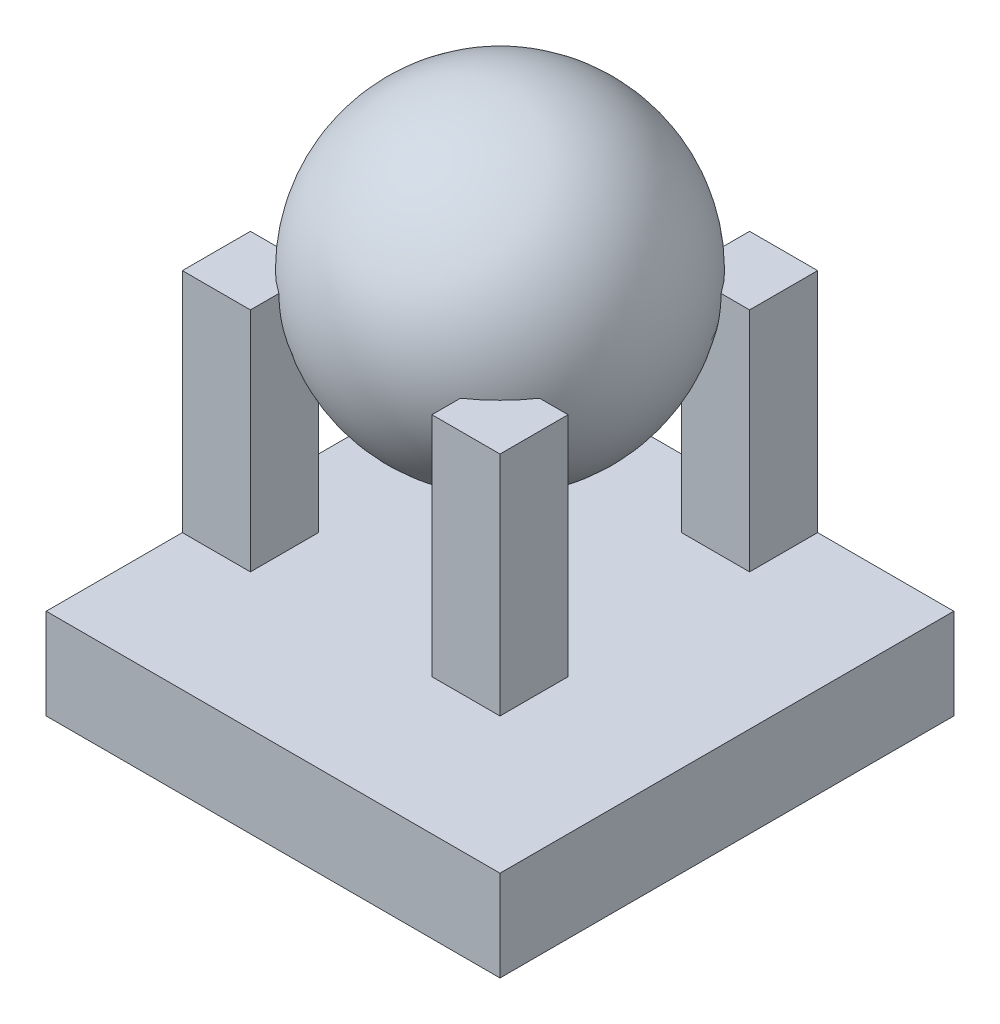
ISO-10303-21;
HEADER;
FILE_DESCRIPTION(('STEP AP214'),'2;1');
FILE_NAME('part.step','',(''),(''),'','','');
FILE_SCHEMA(('AUTOMOTIVE_DESIGN { 1 0 10303 214 1 1 1 1 }'));
ENDSEC;
DATA;
#1=APPLICATION_CONTEXT('core data for automotive mechanical design processes');
#2=APPLICATION_PROTOCOL_DEFINITION('international standard','automotive_design',2000,#1);
#3=PRODUCT_CONTEXT('',#1,'mechanical');
#4=PRODUCT('Part','Part','',(#3));
#5=PRODUCT_RELATED_PRODUCT_CATEGORY('part','',(#4));
#6=PRODUCT_DEFINITION_FORMATION('','',#4);
#7=PRODUCT_DEFINITION_CONTEXT('part definition',#1,'design');
#8=PRODUCT_DEFINITION('design','',#6,#7);
#9=PRODUCT_DEFINITION_SHAPE('','',#8);
#10=(LENGTH_UNIT() NAMED_UNIT(*) SI_UNIT(.MILLI.,.METRE.));
#11=(NAMED_UNIT(*) PLANE_ANGLE_UNIT() SI_UNIT($,.RADIAN.));
#12=(NAMED_UNIT(*) SI_UNIT($,.STERADIAN.) SOLID_ANGLE_UNIT());
#13=UNCERTAINTY_MEASURE_WITH_UNIT(LENGTH_MEASURE(1.E-05),#10,'distance_accuracy_value','');
#14=(GEOMETRIC_REPRESENTATION_CONTEXT(3) GLOBAL_UNCERTAINTY_ASSIGNED_CONTEXT((#13)) GLOBAL_UNIT_ASSIGNED_CONTEXT((#10,
#11,#12)) REPRESENTATION_CONTEXT('',''));
#15=CARTESIAN_POINT('',(0.,0.,0.));
#16=DIRECTION('',(0.,0.,1.));
#17=DIRECTION('',(1.,0.,0.));
#18=AXIS2_PLACEMENT_3D('',#15,#16,#17);
#19=CARTESIAN_POINT('',(0.,20.,0.));
#20=DIRECTION('',(0.,-1.,0.));
#21=DIRECTION('',(0.,0.,-1.));
#22=AXIS2_PLACEMENT_3D('',#19,#20,#21);
#23=PLANE('',#22);
#24=DIRECTION('',(0.,0.,-1.));
#25=VECTOR('',#24,1.);
#26=CARTESIAN_POINT('',(-35.,20.,-35.));
#27=LINE('',#26,#25);
#28=CARTESIAN_POINT('',(-35.,20.,-35.));
#29=VERTEX_POINT('',#28);
#30=CARTESIAN_POINT('',(-35.,20.,-50.));
#31=VERTEX_POINT('',#30);
#32=EDGE_CURVE('E258',#29,#31,#27,.T.);
#33=ORIENTED_EDGE('',*,*,#32,.F.);
#34=DIRECTION('',(1.,0.,0.));
#35=VECTOR('',#34,1.);
#36=CARTESIAN_POINT('',(-50.,20.,-35.));
#37=LINE('',#36,#35);
#38=CARTESIAN_POINT('',(-50.,20.,-35.));
#39=VERTEX_POINT('',#38);
#40=EDGE_CURVE('E263',#39,#29,#37,.T.);
#41=ORIENTED_EDGE('',*,*,#40,.F.);
#42=DIRECTION('',(0.,0.,1.));
#43=VECTOR('',#42,1.);
#44=CARTESIAN_POINT('',(-50.,20.,50.));
#45=LINE('',#44,#43);
#46=CARTESIAN_POINT('',(-50.,20.,5.));
#47=VERTEX_POINT('',#46);
#48=EDGE_CURVE('E383',#39,#47,#45,.T.);
#49=ORIENTED_EDGE('',*,*,#48,.T.);
#50=DIRECTION('',(-1.,0.,0.));
#51=VECTOR('',#50,1.);
#52=CARTESIAN_POINT('',(-50.,20.,5.));
#53=LINE('',#52,#51);
#54=CARTESIAN_POINT('',(-35.,20.,5.));
#55=VERTEX_POINT('',#54);
#56=EDGE_CURVE('E351',#55,#47,#53,.T.);
#57=ORIENTED_EDGE('',*,*,#56,.F.);
#58=DIRECTION('',(0.,0.,-1.));
#59=VECTOR('',#58,1.);
#60=CARTESIAN_POINT('',(-35.,20.,20.));
#61=LINE('',#60,#59);
#62=CARTESIAN_POINT('',(-35.,20.,20.));
#63=VERTEX_POINT('',#62);
#64=EDGE_CURVE('E332',#63,#55,#61,.T.);
#65=ORIENTED_EDGE('',*,*,#64,.F.);
#66=DIRECTION('',(1.,0.,0.));
#67=VECTOR('',#66,1.);
#68=CARTESIAN_POINT('',(-50.,20.,20.));
#69=LINE('',#68,#67);
#70=CARTESIAN_POINT('',(-50.,20.,20.));
#71=VERTEX_POINT('',#70);
#72=EDGE_CURVE('E338',#71,#63,#69,.T.);
#73=ORIENTED_EDGE('',*,*,#72,.F.);
#74=CARTESIAN_POINT('',(-50.,20.,50.));
#75=VERTEX_POINT('',#74);
#76=EDGE_CURVE('E382',#71,#75,#45,.T.);
#77=ORIENTED_EDGE('',*,*,#76,.T.);
#78=DIRECTION('',(1.,0.,0.));
#79=VECTOR('',#78,1.);
#80=CARTESIAN_POINT('',(-50.,20.,50.));
#81=LINE('',#80,#79);
#82=CARTESIAN_POINT('',(50.,20.,50.));
#83=VERTEX_POINT('',#82);
#84=EDGE_CURVE('E386',#75,#83,#81,.T.);
#85=ORIENTED_EDGE('',*,*,#84,.T.);
#86=DIRECTION('',(0.,0.,-1.));
#87=VECTOR('',#86,1.);
#88=CARTESIAN_POINT('',(50.,20.,50.));
#89=LINE('',#88,#87);
#90=CARTESIAN_POINT('',(50.,20.,-50.));
#91=VERTEX_POINT('',#90);
#92=EDGE_CURVE('E373',#83,#91,#89,.T.);
#93=ORIENTED_EDGE('',*,*,#92,.T.);
#94=DIRECTION('',(-1.,0.,0.));
#95=VECTOR('',#94,1.);
#96=CARTESIAN_POINT('',(-50.,20.,-50.));
#97=LINE('',#96,#95);
#98=CARTESIAN_POINT('',(20.,20.,-50.));
#99=VERTEX_POINT('',#98);
#100=EDGE_CURVE('E379',#91,#99,#97,.T.);
#101=ORIENTED_EDGE('',*,*,#100,.T.);
#102=DIRECTION('',(0.,0.,-1.));
#103=VECTOR('',#102,1.);
#104=CARTESIAN_POINT('',(20.,20.,-35.));
#105=LINE('',#104,#103);
#106=CARTESIAN_POINT('',(20.,20.,-35.));
#107=VERTEX_POINT('',#106);
#108=EDGE_CURVE('E291',#107,#99,#105,.T.);
#109=ORIENTED_EDGE('',*,*,#108,.F.);
#110=DIRECTION('',(1.,0.,0.));
#111=VECTOR('',#110,1.);
#112=CARTESIAN_POINT('',(5.,20.,-35.));
#113=LINE('',#112,#111);
#114=CARTESIAN_POINT('',(5.,20.,-35.));
#115=VERTEX_POINT('',#114);
#116=EDGE_CURVE('E297',#115,#107,#113,.T.);
#117=ORIENTED_EDGE('',*,*,#116,.F.);
#118=DIRECTION('',(0.,0.,1.));
#119=VECTOR('',#118,1.);
#120=CARTESIAN_POINT('',(5.,20.,-35.));
#121=LINE('',#120,#119);
#122=CARTESIAN_POINT('',(5.,20.,-50.));
#123=VERTEX_POINT('',#122);
#124=EDGE_CURVE('E311',#123,#115,#121,.T.);
#125=ORIENTED_EDGE('',*,*,#124,.F.);
#126=EDGE_CURVE('E377',#123,#31,#97,.T.);
#127=ORIENTED_EDGE('',*,*,#126,.T.);
#128=EDGE_LOOP('',(#33,#41,#49,#57,#65,#73,#77,#85,#93,#101,#109,#117,#125,#127));
#129=FACE_BOUND('',#128,.T.);
#130=DIRECTION('',(0.,0.,-1.));
#131=VECTOR('',#130,1.);
#132=CARTESIAN_POINT('',(20.,20.,20.));
#133=LINE('',#132,#131);
#134=CARTESIAN_POINT('',(20.,20.,20.));
#135=VERTEX_POINT('',#134);
#136=CARTESIAN_POINT('',(20.,20.,5.));
#137=VERTEX_POINT('',#136);
#138=EDGE_CURVE('E231',#135,#137,#133,.T.);
#139=ORIENTED_EDGE('',*,*,#138,.F.);
#140=DIRECTION('',(1.,0.,0.));
#141=VECTOR('',#140,1.);
#142=CARTESIAN_POINT('',(5.,20.,20.));
#143=LINE('',#142,#141);
#144=CARTESIAN_POINT('',(5.,20.,20.));
#145=VERTEX_POINT('',#144);
#146=EDGE_CURVE('E224',#145,#135,#143,.T.);
#147=ORIENTED_EDGE('',*,*,#146,.F.);
#148=DIRECTION('',(0.,0.,1.));
#149=VECTOR('',#148,1.);
#150=CARTESIAN_POINT('',(5.,20.,20.));
#151=LINE('',#150,#149);
#152=CARTESIAN_POINT('',(5.,20.,5.));
#153=VERTEX_POINT('',#152);
#154=EDGE_CURVE('E239',#153,#145,#151,.T.);
#155=ORIENTED_EDGE('',*,*,#154,.F.);
#156=DIRECTION('',(-1.,0.,0.));
#157=VECTOR('',#156,1.);
#158=CARTESIAN_POINT('',(5.,20.,5.));
#159=LINE('',#158,#157);
#160=EDGE_CURVE('E235',#137,#153,#159,.T.);
#161=ORIENTED_EDGE('',*,*,#160,.F.);
#162=EDGE_LOOP('',(#139,#147,#155,#161));
#163=FACE_BOUND('',#162,.T.);
#164=ADVANCED_FACE('F39',(#129,#163),#23,.F.);
#165=CARTESIAN_POINT('',(50.,20.,50.));
#166=DIRECTION('',(-1.,0.,0.));
#167=DIRECTION('',(0.,0.,1.));
#168=AXIS2_PLACEMENT_3D('',#165,#166,#167);
#169=PLANE('',#168);
#170=DIRECTION('',(0.,0.,-1.));
#171=VECTOR('',#170,1.);
#172=CARTESIAN_POINT('',(50.,0.,50.));
#173=LINE('',#172,#171);
#174=CARTESIAN_POINT('',(50.,0.,50.));
#175=VERTEX_POINT('',#174);
#176=CARTESIAN_POINT('',(50.,0.,-50.));
#177=VERTEX_POINT('',#176);
#178=EDGE_CURVE('E372',#175,#177,#173,.T.);
#179=ORIENTED_EDGE('',*,*,#178,.T.);
#180=DIRECTION('',(0.,-1.,0.));
#181=VECTOR('',#180,1.);
#182=CARTESIAN_POINT('',(50.,20.,-50.));
#183=LINE('',#182,#181);
#184=EDGE_CURVE('E48',#91,#177,#183,.T.);
#185=ORIENTED_EDGE('',*,*,#184,.F.);
#186=ORIENTED_EDGE('',*,*,#92,.F.);
#187=DIRECTION('',(0.,-1.,0.));
#188=VECTOR('',#187,1.);
#189=CARTESIAN_POINT('',(50.,20.,50.));
#190=LINE('',#189,#188);
#191=EDGE_CURVE('E389',#83,#175,#190,.T.);
#192=ORIENTED_EDGE('',*,*,#191,.T.);
#193=EDGE_LOOP('',(#179,#185,#186,#192));
#194=FACE_BOUND('',#193,.T.);
#195=ADVANCED_FACE('F41',(#194),#169,.F.);
#196=CARTESIAN_POINT('',(-50.,20.,-50.));
#197=DIRECTION('',(0.,0.,1.));
#198=DIRECTION('',(1.,0.,0.));
#199=AXIS2_PLACEMENT_3D('',#196,#197,#198);
#200=PLANE('',#199);
#201=DIRECTION('',(-1.,0.,0.));
#202=VECTOR('',#201,1.);
#203=CARTESIAN_POINT('',(-50.,0.,-50.));
#204=LINE('',#203,#202);
#205=CARTESIAN_POINT('',(-50.,0.,-50.));
#206=VERTEX_POINT('',#205);
#207=EDGE_CURVE('E393',#177,#206,#204,.T.);
#208=ORIENTED_EDGE('',*,*,#207,.T.);
#209=DIRECTION('',(0.,-1.,0.));
#210=VECTOR('',#209,1.);
#211=CARTESIAN_POINT('',(-50.,20.,-50.));
#212=LINE('',#211,#210);
#213=CARTESIAN_POINT('',(-50.,70.,-50.));
#214=VERTEX_POINT('',#213);
#215=EDGE_CURVE('E408',#214,#206,#212,.T.);
#216=ORIENTED_EDGE('',*,*,#215,.F.);
#217=DIRECTION('',(-1.,0.,0.));
#218=VECTOR('',#217,1.);
#219=CARTESIAN_POINT('',(-50.,70.,-50.));
#220=LINE('',#219,#218);
#221=CARTESIAN_POINT('',(-35.,70.,-50.));
#222=VERTEX_POINT('',#221);
#223=EDGE_CURVE('E262',#222,#214,#220,.T.);
#224=ORIENTED_EDGE('',*,*,#223,.F.);
#225=DIRECTION('',(0.,-1.,0.));
#226=VECTOR('',#225,1.);
#227=CARTESIAN_POINT('',(-35.,70.,-50.));
#228=LINE('',#227,#226);
#229=EDGE_CURVE('E287',#222,#31,#228,.T.);
#230=ORIENTED_EDGE('',*,*,#229,.T.);
#231=ORIENTED_EDGE('',*,*,#126,.F.);
#232=DIRECTION('',(0.,-1.,0.));
#233=VECTOR('',#232,1.);
#234=CARTESIAN_POINT('',(5.,70.,-50.));
#235=LINE('',#234,#233);
#236=CARTESIAN_POINT('',(5.,70.,-50.));
#237=VERTEX_POINT('',#236);
#238=EDGE_CURVE('E324',#237,#123,#235,.T.);
#239=ORIENTED_EDGE('',*,*,#238,.F.);
#240=DIRECTION('',(-1.,0.,0.));
#241=VECTOR('',#240,1.);
#242=CARTESIAN_POINT('',(5.,70.,-50.));
#243=LINE('',#242,#241);
#244=CARTESIAN_POINT('',(20.,70.,-50.));
#245=VERTEX_POINT('',#244);
#246=EDGE_CURVE('E296',#245,#237,#243,.T.);
#247=ORIENTED_EDGE('',*,*,#246,.F.);
#248=DIRECTION('',(0.,-1.,0.));
#249=VECTOR('',#248,1.);
#250=CARTESIAN_POINT('',(20.,70.,-50.));
#251=LINE('',#250,#249);
#252=EDGE_CURVE('E328',#245,#99,#251,.T.);
#253=ORIENTED_EDGE('',*,*,#252,.T.);
#254=ORIENTED_EDGE('',*,*,#100,.F.);
#255=ORIENTED_EDGE('',*,*,#184,.T.);
#256=EDGE_LOOP('',(#208,#216,#224,#230,#231,#239,#247,#253,#254,#255));
#257=FACE_BOUND('',#256,.T.);
#258=ADVANCED_FACE('F415',(#257),#200,.F.);
#259=CARTESIAN_POINT('',(-50.,20.,50.));
#260=DIRECTION('',(1.,0.,0.));
#261=DIRECTION('',(0.,0.,-1.));
#262=AXIS2_PLACEMENT_3D('',#259,#260,#261);
#263=PLANE('',#262);
#264=DIRECTION('',(0.,0.,1.));
#265=VECTOR('',#264,1.);
#266=CARTESIAN_POINT('',(-50.,0.,50.));
#267=LINE('',#266,#265);
#268=CARTESIAN_POINT('',(-50.,0.,50.));
#269=VERTEX_POINT('',#268);
#270=EDGE_CURVE('E396',#206,#269,#267,.T.);
#271=ORIENTED_EDGE('',*,*,#270,.T.);
#272=DIRECTION('',(0.,-1.,0.));
#273=VECTOR('',#272,1.);
#274=CARTESIAN_POINT('',(-50.,20.,50.));
#275=LINE('',#274,#273);
#276=EDGE_CURVE('E404',#75,#269,#275,.T.);
#277=ORIENTED_EDGE('',*,*,#276,.F.);
#278=ORIENTED_EDGE('',*,*,#76,.F.);
#279=DIRECTION('',(0.,-1.,0.));
#280=VECTOR('',#279,1.);
#281=CARTESIAN_POINT('',(-50.,70.,20.));
#282=LINE('',#281,#280);
#283=CARTESIAN_POINT('',(-50.,70.,20.));
#284=VERTEX_POINT('',#283);
#285=EDGE_CURVE('E361',#284,#71,#282,.T.);
#286=ORIENTED_EDGE('',*,*,#285,.F.);
#287=DIRECTION('',(0.,0.,1.));
#288=VECTOR('',#287,1.);
#289=CARTESIAN_POINT('',(-50.,70.,20.));
#290=LINE('',#289,#288);
#291=CARTESIAN_POINT('',(-50.,70.,5.));
#292=VERTEX_POINT('',#291);
#293=EDGE_CURVE('E341',#292,#284,#290,.T.);
#294=ORIENTED_EDGE('',*,*,#293,.F.);
#295=DIRECTION('',(0.,-1.,0.));
#296=VECTOR('',#295,1.);
#297=CARTESIAN_POINT('',(-50.,70.,5.));
#298=LINE('',#297,#296);
#299=EDGE_CURVE('E365',#292,#47,#298,.T.);
#300=ORIENTED_EDGE('',*,*,#299,.T.);
#301=ORIENTED_EDGE('',*,*,#48,.F.);
#302=DIRECTION('',(0.,-1.,0.));
#303=VECTOR('',#302,1.);
#304=CARTESIAN_POINT('',(-50.,70.,-35.));
#305=LINE('',#304,#303);
#306=CARTESIAN_POINT('',(-50.,70.,-35.));
#307=VERTEX_POINT('',#306);
#308=EDGE_CURVE('E283',#307,#39,#305,.T.);
#309=ORIENTED_EDGE('',*,*,#308,.F.);
#310=DIRECTION('',(0.,0.,1.));
#311=VECTOR('',#310,1.);
#312=CARTESIAN_POINT('',(-50.,70.,-35.));
#313=LINE('',#312,#311);
#314=EDGE_CURVE('E267',#214,#307,#313,.T.);
#315=ORIENTED_EDGE('',*,*,#314,.F.);
#316=ORIENTED_EDGE('',*,*,#215,.T.);
#317=EDGE_LOOP('',(#271,#277,#278,#286,#294,#300,#301,#309,#315,#316));
#318=FACE_BOUND('',#317,.T.);
#319=ADVANCED_FACE('F426',(#318),#263,.F.);
#320=CARTESIAN_POINT('',(-50.,20.,50.));
#321=DIRECTION('',(0.,0.,-1.));
#322=DIRECTION('',(-1.,0.,0.));
#323=AXIS2_PLACEMENT_3D('',#320,#321,#322);
#324=PLANE('',#323);
#325=DIRECTION('',(1.,0.,0.));
#326=VECTOR('',#325,1.);
#327=CARTESIAN_POINT('',(-50.,0.,50.));
#328=LINE('',#327,#326);
#329=EDGE_CURVE('E378',#269,#175,#328,.T.);
#330=ORIENTED_EDGE('',*,*,#329,.T.);
#331=ORIENTED_EDGE('',*,*,#191,.F.);
#332=ORIENTED_EDGE('',*,*,#84,.F.);
#333=ORIENTED_EDGE('',*,*,#276,.T.);
#334=EDGE_LOOP('',(#330,#331,#332,#333));
#335=FACE_BOUND('',#334,.T.);
#336=ADVANCED_FACE('F431',(#335),#324,.F.);
#337=CARTESIAN_POINT('',(0.,0.,0.));
#338=DIRECTION('',(0.,-1.,0.));
#339=DIRECTION('',(0.,0.,-1.));
#340=AXIS2_PLACEMENT_3D('',#337,#338,#339);
#341=PLANE('',#340);
#342=ORIENTED_EDGE('',*,*,#178,.F.);
#343=ORIENTED_EDGE('',*,*,#329,.F.);
#344=ORIENTED_EDGE('',*,*,#270,.F.);
#345=ORIENTED_EDGE('',*,*,#207,.F.);
#346=EDGE_LOOP('',(#342,#343,#344,#345));
#347=FACE_BOUND('',#346,.T.);
#348=ADVANCED_FACE('F422',(#347),#341,.T.);
#349=CARTESIAN_POINT('',(-35.,70.,20.));
#350=DIRECTION('',(-1.,0.,0.));
#351=DIRECTION('',(0.,0.,1.));
#352=AXIS2_PLACEMENT_3D('',#349,#350,#351);
#353=PLANE('',#352);
#354=DIRECTION('',(0.,-1.,0.));
#355=VECTOR('',#354,1.);
#356=CARTESIAN_POINT('',(-35.,70.,5.));
#357=LINE('',#356,#355);
#358=CARTESIAN_POINT('',(-35.,49.3844718719117,5.));
#359=VERTEX_POINT('',#358);
#360=EDGE_CURVE('E369',#359,#55,#357,.T.);
#361=ORIENTED_EDGE('',*,*,#360,.F.);
#362=CARTESIAN_POINT('',(-35.,70.,-15.));
#363=DIRECTION('',(-1.,0.,0.));
#364=DIRECTION('',(0.,0.,1.));
#365=AXIS2_PLACEMENT_3D('',#362,#363,#364);
#366=CIRCLE('',#365,28.7228132326901);
#367=CARTESIAN_POINT('',(-35.,70.,13.7228132326901));
#368=VERTEX_POINT('',#367);
#369=EDGE_CURVE('E236',#359,#368,#366,.T.);
#370=ORIENTED_EDGE('',*,*,#369,.T.);
#371=DIRECTION('',(0.,0.,-1.));
#372=VECTOR('',#371,1.);
#373=CARTESIAN_POINT('',(-35.,70.,20.));
#374=LINE('',#373,#372);
#375=CARTESIAN_POINT('',(-35.,70.,20.));
#376=VERTEX_POINT('',#375);
#377=EDGE_CURVE('E333',#376,#368,#374,.T.);
#378=ORIENTED_EDGE('',*,*,#377,.F.);
#379=DIRECTION('',(0.,-1.,0.));
#380=VECTOR('',#379,1.);
#381=CARTESIAN_POINT('',(-35.,70.,20.));
#382=LINE('',#381,#380);
#383=EDGE_CURVE('E347',#376,#63,#382,.T.);
#384=ORIENTED_EDGE('',*,*,#383,.T.);
#385=ORIENTED_EDGE('',*,*,#64,.T.);
#386=EDGE_LOOP('',(#361,#370,#378,#384,#385));
#387=FACE_BOUND('',#386,.T.);
#388=ADVANCED_FACE('F472',(#387),#353,.F.);
#389=CARTESIAN_POINT('',(-50.,70.,5.));
#390=DIRECTION('',(0.,0.,1.));
#391=DIRECTION('',(1.,0.,0.));
#392=AXIS2_PLACEMENT_3D('',#389,#390,#391);
#393=PLANE('',#392);
#394=DIRECTION('',(-1.,0.,0.));
#395=VECTOR('',#394,1.);
#396=CARTESIAN_POINT('',(-50.,70.,5.));
#397=LINE('',#396,#395);
#398=CARTESIAN_POINT('',(-43.7228132326901,70.,5.));
#399=VERTEX_POINT('',#398);
#400=EDGE_CURVE('E337',#399,#292,#397,.T.);
#401=ORIENTED_EDGE('',*,*,#400,.F.);
#402=CARTESIAN_POINT('',(-15.,70.,5.));
#403=DIRECTION('',(0.,0.,1.));
#404=DIRECTION('',(1.,0.,0.));
#405=AXIS2_PLACEMENT_3D('',#402,#403,#404);
#406=CIRCLE('',#405,28.7228132326901);
#407=EDGE_CURVE('E55',#399,#359,#406,.T.);
#408=ORIENTED_EDGE('',*,*,#407,.T.);
#409=ORIENTED_EDGE('',*,*,#360,.T.);
#410=ORIENTED_EDGE('',*,*,#56,.T.);
#411=ORIENTED_EDGE('',*,*,#299,.F.);
#412=EDGE_LOOP('',(#401,#408,#409,#410,#411));
#413=FACE_BOUND('',#412,.T.);
#414=ADVANCED_FACE('F460',(#413),#393,.F.);
#415=CARTESIAN_POINT('',(-50.,70.,20.));
#416=DIRECTION('',(0.,0.,-1.));
#417=DIRECTION('',(-1.,0.,0.));
#418=AXIS2_PLACEMENT_3D('',#415,#416,#417);
#419=PLANE('',#418);
#420=ORIENTED_EDGE('',*,*,#72,.T.);
#421=ORIENTED_EDGE('',*,*,#383,.F.);
#422=DIRECTION('',(1.,0.,0.));
#423=VECTOR('',#422,1.);
#424=CARTESIAN_POINT('',(-50.,70.,20.));
#425=LINE('',#424,#423);
#426=EDGE_CURVE('E344',#284,#376,#425,.T.);
#427=ORIENTED_EDGE('',*,*,#426,.F.);
#428=ORIENTED_EDGE('',*,*,#285,.T.);
#429=EDGE_LOOP('',(#420,#421,#427,#428));
#430=FACE_BOUND('',#429,.T.);
#431=ADVANCED_FACE('F475',(#430),#419,.F.);
#432=CARTESIAN_POINT('',(0.,70.,0.));
#433=DIRECTION('',(0.,-1.,0.));
#434=DIRECTION('',(0.,0.,-1.));
#435=AXIS2_PLACEMENT_3D('',#432,#433,#434);
#436=PLANE('',#435);
#437=ORIENTED_EDGE('',*,*,#377,.T.);
#438=CARTESIAN_POINT('',(-15.,70.,-15.));
#439=DIRECTION('',(0.,-1.,0.));
#440=DIRECTION('',(0.,0.,-1.));
#441=AXIS2_PLACEMENT_3D('',#438,#439,#440);
#442=CIRCLE('',#441,35.);
#443=EDGE_CURVE('E467',#368,#399,#442,.T.);
#444=ORIENTED_EDGE('',*,*,#443,.T.);
#445=ORIENTED_EDGE('',*,*,#400,.T.);
#446=ORIENTED_EDGE('',*,*,#293,.T.);
#447=ORIENTED_EDGE('',*,*,#426,.T.);
#448=EDGE_LOOP('',(#437,#444,#445,#446,#447));
#449=FACE_BOUND('',#448,.T.);
#450=ADVANCED_FACE('F465',(#449),#436,.F.);
#451=CARTESIAN_POINT('',(20.,70.,-35.));
#452=DIRECTION('',(-1.,0.,0.));
#453=DIRECTION('',(0.,0.,1.));
#454=AXIS2_PLACEMENT_3D('',#451,#452,#453);
#455=PLANE('',#454);
#456=ORIENTED_EDGE('',*,*,#108,.T.);
#457=ORIENTED_EDGE('',*,*,#252,.F.);
#458=DIRECTION('',(0.,0.,-1.));
#459=VECTOR('',#458,1.);
#460=CARTESIAN_POINT('',(20.,70.,-35.));
#461=LINE('',#460,#459);
#462=CARTESIAN_POINT('',(20.,70.,-35.));
#463=VERTEX_POINT('',#462);
#464=EDGE_CURVE('E292',#463,#245,#461,.T.);
#465=ORIENTED_EDGE('',*,*,#464,.F.);
#466=DIRECTION('',(0.,-1.,0.));
#467=VECTOR('',#466,1.);
#468=CARTESIAN_POINT('',(20.,70.,-35.));
#469=LINE('',#468,#467);
#470=EDGE_CURVE('E307',#463,#107,#469,.T.);
#471=ORIENTED_EDGE('',*,*,#470,.T.);
#472=EDGE_LOOP('',(#456,#457,#465,#471));
#473=FACE_BOUND('',#472,.T.);
#474=ADVANCED_FACE('F482',(#473),#455,.F.);
#475=CARTESIAN_POINT('',(5.,70.,-35.));
#476=DIRECTION('',(1.,0.,0.));
#477=DIRECTION('',(0.,0.,-1.));
#478=AXIS2_PLACEMENT_3D('',#475,#476,#477);
#479=PLANE('',#478);
#480=DIRECTION('',(0.,-1.,0.));
#481=VECTOR('',#480,1.);
#482=CARTESIAN_POINT('',(5.,70.,-35.));
#483=LINE('',#482,#481);
#484=CARTESIAN_POINT('',(5.,49.3844718719117,-35.));
#485=VERTEX_POINT('',#484);
#486=EDGE_CURVE('E321',#485,#115,#483,.T.);
#487=ORIENTED_EDGE('',*,*,#486,.F.);
#488=CARTESIAN_POINT('',(5.,70.,-15.));
#489=DIRECTION('',(1.,0.,0.));
#490=DIRECTION('',(0.,0.,-1.));
#491=AXIS2_PLACEMENT_3D('',#488,#489,#490);
#492=CIRCLE('',#491,28.7228132326901);
#493=CARTESIAN_POINT('',(5.,70.,-43.7228132326901));
#494=VERTEX_POINT('',#493);
#495=EDGE_CURVE('E648',#485,#494,#492,.T.);
#496=ORIENTED_EDGE('',*,*,#495,.T.);
#497=DIRECTION('',(0.,0.,1.));
#498=VECTOR('',#497,1.);
#499=CARTESIAN_POINT('',(5.,70.,-35.));
#500=LINE('',#499,#498);
#501=EDGE_CURVE('E300',#237,#494,#500,.T.);
#502=ORIENTED_EDGE('',*,*,#501,.F.);
#503=ORIENTED_EDGE('',*,*,#238,.T.);
#504=ORIENTED_EDGE('',*,*,#124,.T.);
#505=EDGE_LOOP('',(#487,#496,#502,#503,#504));
#506=FACE_BOUND('',#505,.T.);
#507=ADVANCED_FACE('F538',(#506),#479,.F.);
#508=CARTESIAN_POINT('',(5.,70.,-35.));
#509=DIRECTION('',(0.,0.,-1.));
#510=DIRECTION('',(-1.,0.,0.));
#511=AXIS2_PLACEMENT_3D('',#508,#509,#510);
#512=PLANE('',#511);
#513=DIRECTION('',(1.,0.,0.));
#514=VECTOR('',#513,1.);
#515=CARTESIAN_POINT('',(5.,70.,-35.));
#516=LINE('',#515,#514);
#517=CARTESIAN_POINT('',(13.7228132326901,70.,-35.));
#518=VERTEX_POINT('',#517);
#519=EDGE_CURVE('E304',#518,#463,#516,.T.);
#520=ORIENTED_EDGE('',*,*,#519,.F.);
#521=CARTESIAN_POINT('',(-15.,70.,-35.));
#522=DIRECTION('',(0.,0.,-1.));
#523=DIRECTION('',(-1.,0.,0.));
#524=AXIS2_PLACEMENT_3D('',#521,#522,#523);
#525=CIRCLE('',#524,28.7228132326901);
#526=EDGE_CURVE('E63',#518,#485,#525,.T.);
#527=ORIENTED_EDGE('',*,*,#526,.T.);
#528=ORIENTED_EDGE('',*,*,#486,.T.);
#529=ORIENTED_EDGE('',*,*,#116,.T.);
#530=ORIENTED_EDGE('',*,*,#470,.F.);
#531=EDGE_LOOP('',(#520,#527,#528,#529,#530));
#532=FACE_BOUND('',#531,.T.);
#533=ADVANCED_FACE('F543',(#532),#512,.F.);
#534=CARTESIAN_POINT('',(0.,70.,0.));
#535=DIRECTION('',(0.,-1.,0.));
#536=DIRECTION('',(0.,0.,-1.));
#537=AXIS2_PLACEMENT_3D('',#534,#535,#536);
#538=PLANE('',#537);
#539=ORIENTED_EDGE('',*,*,#501,.T.);
#540=CARTESIAN_POINT('',(-15.,70.,-15.));
#541=DIRECTION('',(0.,-1.,0.));
#542=DIRECTION('',(0.,0.,-1.));
#543=AXIS2_PLACEMENT_3D('',#540,#541,#542);
#544=CIRCLE('',#543,35.);
#545=EDGE_CURVE('E649',#494,#518,#544,.T.);
#546=ORIENTED_EDGE('',*,*,#545,.T.);
#547=ORIENTED_EDGE('',*,*,#519,.T.);
#548=ORIENTED_EDGE('',*,*,#464,.T.);
#549=ORIENTED_EDGE('',*,*,#246,.T.);
#550=EDGE_LOOP('',(#539,#546,#547,#548,#549));
#551=FACE_BOUND('',#550,.T.);
#552=ADVANCED_FACE('F553',(#551),#538,.F.);
#553=CARTESIAN_POINT('',(-35.,70.,-35.));
#554=DIRECTION('',(-1.,0.,0.));
#555=DIRECTION('',(0.,0.,1.));
#556=AXIS2_PLACEMENT_3D('',#553,#554,#555);
#557=PLANE('',#556);
#558=DIRECTION('',(0.,0.,-1.));
#559=VECTOR('',#558,1.);
#560=CARTESIAN_POINT('',(-35.,70.,-35.));
#561=LINE('',#560,#559);
#562=CARTESIAN_POINT('',(-35.,70.,-43.7228132326901));
#563=VERTEX_POINT('',#562);
#564=EDGE_CURVE('E259',#563,#222,#561,.T.);
#565=ORIENTED_EDGE('',*,*,#564,.F.);
#566=CARTESIAN_POINT('',(-35.,70.,-15.));
#567=DIRECTION('',(-1.,0.,0.));
#568=DIRECTION('',(0.,0.,1.));
#569=AXIS2_PLACEMENT_3D('',#566,#567,#568);
#570=CIRCLE('',#569,28.7228132326901);
#571=CARTESIAN_POINT('',(-35.,49.3844718719117,-35.));
#572=VERTEX_POINT('',#571);
#573=EDGE_CURVE('E449',#563,#572,#570,.T.);
#574=ORIENTED_EDGE('',*,*,#573,.T.);
#575=DIRECTION('',(0.,-1.,0.));
#576=VECTOR('',#575,1.);
#577=CARTESIAN_POINT('',(-35.,70.,-35.));
#578=LINE('',#577,#576);
#579=EDGE_CURVE('E274',#572,#29,#578,.T.);
#580=ORIENTED_EDGE('',*,*,#579,.T.);
#581=ORIENTED_EDGE('',*,*,#32,.T.);
#582=ORIENTED_EDGE('',*,*,#229,.F.);
#583=EDGE_LOOP('',(#565,#574,#580,#581,#582));
#584=FACE_BOUND('',#583,.T.);
#585=ADVANCED_FACE('F446',(#584),#557,.F.);
#586=CARTESIAN_POINT('',(-50.,70.,-35.));
#587=DIRECTION('',(0.,0.,-1.));
#588=DIRECTION('',(-1.,0.,0.));
#589=AXIS2_PLACEMENT_3D('',#586,#587,#588);
#590=PLANE('',#589);
#591=ORIENTED_EDGE('',*,*,#579,.F.);
#592=CARTESIAN_POINT('',(-15.,70.,-35.));
#593=DIRECTION('',(0.,0.,-1.));
#594=DIRECTION('',(-1.,0.,0.));
#595=AXIS2_PLACEMENT_3D('',#592,#593,#594);
#596=CIRCLE('',#595,28.7228132326901);
#597=CARTESIAN_POINT('',(-43.7228132326901,70.,-35.));
#598=VERTEX_POINT('',#597);
#599=EDGE_CURVE('E454',#572,#598,#596,.T.);
#600=ORIENTED_EDGE('',*,*,#599,.T.);
#601=DIRECTION('',(1.,0.,0.));
#602=VECTOR('',#601,1.);
#603=CARTESIAN_POINT('',(-50.,70.,-35.));
#604=LINE('',#603,#602);
#605=EDGE_CURVE('E270',#307,#598,#604,.T.);
#606=ORIENTED_EDGE('',*,*,#605,.F.);
#607=ORIENTED_EDGE('',*,*,#308,.T.);
#608=ORIENTED_EDGE('',*,*,#40,.T.);
#609=EDGE_LOOP('',(#591,#600,#606,#607,#608));
#610=FACE_BOUND('',#609,.T.);
#611=ADVANCED_FACE('F452',(#610),#590,.F.);
#612=CARTESIAN_POINT('',(0.,70.,0.));
#613=DIRECTION('',(0.,-1.,0.));
#614=DIRECTION('',(0.,0.,-1.));
#615=AXIS2_PLACEMENT_3D('',#612,#613,#614);
#616=PLANE('',#615);
#617=ORIENTED_EDGE('',*,*,#605,.T.);
#618=CARTESIAN_POINT('',(-15.,70.,-15.));
#619=DIRECTION('',(0.,-1.,0.));
#620=DIRECTION('',(0.,0.,-1.));
#621=AXIS2_PLACEMENT_3D('',#618,#619,#620);
#622=CIRCLE('',#621,35.);
#623=EDGE_CURVE('E211',#598,#563,#622,.T.);
#624=ORIENTED_EDGE('',*,*,#623,.T.);
#625=ORIENTED_EDGE('',*,*,#564,.T.);
#626=ORIENTED_EDGE('',*,*,#223,.T.);
#627=ORIENTED_EDGE('',*,*,#314,.T.);
#628=EDGE_LOOP('',(#617,#624,#625,#626,#627));
#629=FACE_BOUND('',#628,.T.);
#630=ADVANCED_FACE('F580',(#629),#616,.F.);
#631=CARTESIAN_POINT('',(20.,70.,20.));
#632=DIRECTION('',(-1.,0.,0.));
#633=DIRECTION('',(0.,0.,1.));
#634=AXIS2_PLACEMENT_3D('',#631,#632,#633);
#635=PLANE('',#634);
#636=ORIENTED_EDGE('',*,*,#138,.T.);
#637=DIRECTION('',(0.,-1.,0.));
#638=VECTOR('',#637,1.);
#639=CARTESIAN_POINT('',(20.,70.,5.));
#640=LINE('',#639,#638);
#641=CARTESIAN_POINT('',(20.,70.,5.));
#642=VERTEX_POINT('',#641);
#643=EDGE_CURVE('E255',#642,#137,#640,.T.);
#644=ORIENTED_EDGE('',*,*,#643,.F.);
#645=DIRECTION('',(0.,0.,-1.));
#646=VECTOR('',#645,1.);
#647=CARTESIAN_POINT('',(20.,70.,20.));
#648=LINE('',#647,#646);
#649=CARTESIAN_POINT('',(20.,70.,20.));
#650=VERTEX_POINT('',#649);
#651=EDGE_CURVE('E215',#650,#642,#648,.T.);
#652=ORIENTED_EDGE('',*,*,#651,.F.);
#653=DIRECTION('',(0.,-1.,0.));
#654=VECTOR('',#653,1.);
#655=CARTESIAN_POINT('',(20.,70.,20.));
#656=LINE('',#655,#654);
#657=EDGE_CURVE('E230',#650,#135,#656,.T.);
#658=ORIENTED_EDGE('',*,*,#657,.T.);
#659=EDGE_LOOP('',(#636,#644,#652,#658));
#660=FACE_BOUND('',#659,.T.);
#661=ADVANCED_FACE('F589',(#660),#635,.F.);
#662=CARTESIAN_POINT('',(5.,70.,5.));
#663=DIRECTION('',(0.,0.,1.));
#664=DIRECTION('',(1.,0.,0.));
#665=AXIS2_PLACEMENT_3D('',#662,#663,#664);
#666=PLANE('',#665);
#667=DIRECTION('',(0.,-1.,0.));
#668=VECTOR('',#667,1.);
#669=CARTESIAN_POINT('',(5.,70.,5.));
#670=LINE('',#669,#668);
#671=CARTESIAN_POINT('',(5.,49.3844718719117,5.));
#672=VERTEX_POINT('',#671);
#673=EDGE_CURVE('E209',#672,#153,#670,.T.);
#674=ORIENTED_EDGE('',*,*,#673,.F.);
#675=CARTESIAN_POINT('',(-15.,70.,5.));
#676=DIRECTION('',(0.,0.,1.));
#677=DIRECTION('',(1.,0.,0.));
#678=AXIS2_PLACEMENT_3D('',#675,#676,#677);
#679=CIRCLE('',#678,28.7228132326901);
#680=CARTESIAN_POINT('',(13.7228132326901,70.,5.));
#681=VERTEX_POINT('',#680);
#682=EDGE_CURVE('E196',#672,#681,#679,.T.);
#683=ORIENTED_EDGE('',*,*,#682,.T.);
#684=DIRECTION('',(-1.,0.,0.));
#685=VECTOR('',#684,1.);
#686=CARTESIAN_POINT('',(5.,70.,5.));
#687=LINE('',#686,#685);
#688=EDGE_CURVE('E206',#642,#681,#687,.T.);
#689=ORIENTED_EDGE('',*,*,#688,.F.);
#690=ORIENTED_EDGE('',*,*,#643,.T.);
#691=ORIENTED_EDGE('',*,*,#160,.T.);
#692=EDGE_LOOP('',(#674,#683,#689,#690,#691));
#693=FACE_BOUND('',#692,.T.);
#694=ADVANCED_FACE('F204',(#693),#666,.F.);
#695=CARTESIAN_POINT('',(5.,70.,20.));
#696=DIRECTION('',(1.,0.,0.));
#697=DIRECTION('',(0.,0.,-1.));
#698=AXIS2_PLACEMENT_3D('',#695,#696,#697);
#699=PLANE('',#698);
#700=DIRECTION('',(0.,0.,1.));
#701=VECTOR('',#700,1.);
#702=CARTESIAN_POINT('',(5.,70.,20.));
#703=LINE('',#702,#701);
#704=CARTESIAN_POINT('',(5.,70.,13.7228132326901));
#705=VERTEX_POINT('',#704);
#706=CARTESIAN_POINT('',(5.,70.,20.));
#707=VERTEX_POINT('',#706);
#708=EDGE_CURVE('E218',#705,#707,#703,.T.);
#709=ORIENTED_EDGE('',*,*,#708,.F.);
#710=CARTESIAN_POINT('',(5.,70.,-15.));
#711=DIRECTION('',(1.,0.,0.));
#712=DIRECTION('',(0.,0.,-1.));
#713=AXIS2_PLACEMENT_3D('',#710,#711,#712);
#714=CIRCLE('',#713,28.7228132326901);
#715=EDGE_CURVE('E198',#705,#672,#714,.T.);
#716=ORIENTED_EDGE('',*,*,#715,.T.);
#717=ORIENTED_EDGE('',*,*,#673,.T.);
#718=ORIENTED_EDGE('',*,*,#154,.T.);
#719=DIRECTION('',(0.,-1.,0.));
#720=VECTOR('',#719,1.);
#721=CARTESIAN_POINT('',(5.,70.,20.));
#722=LINE('',#721,#720);
#723=EDGE_CURVE('E249',#707,#145,#722,.T.);
#724=ORIENTED_EDGE('',*,*,#723,.F.);
#725=EDGE_LOOP('',(#709,#716,#717,#718,#724));
#726=FACE_BOUND('',#725,.T.);
#727=ADVANCED_FACE('F601',(#726),#699,.F.);
#728=CARTESIAN_POINT('',(5.,70.,20.));
#729=DIRECTION('',(0.,0.,-1.));
#730=DIRECTION('',(-1.,0.,0.));
#731=AXIS2_PLACEMENT_3D('',#728,#729,#730);
#732=PLANE('',#731);
#733=ORIENTED_EDGE('',*,*,#146,.T.);
#734=ORIENTED_EDGE('',*,*,#657,.F.);
#735=DIRECTION('',(1.,0.,0.));
#736=VECTOR('',#735,1.);
#737=CARTESIAN_POINT('',(5.,70.,20.));
#738=LINE('',#737,#736);
#739=EDGE_CURVE('E222',#707,#650,#738,.T.);
#740=ORIENTED_EDGE('',*,*,#739,.F.);
#741=ORIENTED_EDGE('',*,*,#723,.T.);
#742=EDGE_LOOP('',(#733,#734,#740,#741));
#743=FACE_BOUND('',#742,.T.);
#744=ADVANCED_FACE('F610',(#743),#732,.F.);
#745=CARTESIAN_POINT('',(0.,70.,0.));
#746=DIRECTION('',(0.,-1.,0.));
#747=DIRECTION('',(0.,0.,-1.));
#748=AXIS2_PLACEMENT_3D('',#745,#746,#747);
#749=PLANE('',#748);
#750=ORIENTED_EDGE('',*,*,#688,.T.);
#751=CARTESIAN_POINT('',(-15.,70.,-15.));
#752=DIRECTION('',(0.,-1.,0.));
#753=DIRECTION('',(0.,0.,-1.));
#754=AXIS2_PLACEMENT_3D('',#751,#752,#753);
#755=CIRCLE('',#754,35.);
#756=EDGE_CURVE('E11',#681,#705,#755,.T.);
#757=ORIENTED_EDGE('',*,*,#756,.T.);
#758=ORIENTED_EDGE('',*,*,#708,.T.);
#759=ORIENTED_EDGE('',*,*,#739,.T.);
#760=ORIENTED_EDGE('',*,*,#651,.T.);
#761=EDGE_LOOP('',(#750,#757,#758,#759,#760));
#762=FACE_BOUND('',#761,.T.);
#763=ADVANCED_FACE('F213',(#762),#749,.F.);
#764=CARTESIAN_POINT('',(-15.,70.,-15.));
#765=DIRECTION('',(0.,1.,0.));
#766=DIRECTION('',(1.,0.,0.));
#767=AXIS2_PLACEMENT_3D('',#764,#765,#766);
#768=SPHERICAL_SURFACE('',#767,35.);
#769=ORIENTED_EDGE('',*,*,#495,.F.);
#770=ORIENTED_EDGE('',*,*,#526,.F.);
#771=ORIENTED_EDGE('',*,*,#545,.F.);
#772=EDGE_LOOP('',(#769,#770,#771));
#773=FACE_BOUND('',#772,.T.);
#774=ORIENTED_EDGE('',*,*,#682,.F.);
#775=ORIENTED_EDGE('',*,*,#715,.F.);
#776=ORIENTED_EDGE('',*,*,#756,.F.);
#777=EDGE_LOOP('',(#774,#775,#776));
#778=FACE_BOUND('',#777,.T.);
#779=ORIENTED_EDGE('',*,*,#573,.F.);
#780=ORIENTED_EDGE('',*,*,#623,.F.);
#781=ORIENTED_EDGE('',*,*,#599,.F.);
#782=EDGE_LOOP('',(#779,#780,#781));
#783=FACE_BOUND('',#782,.T.);
#784=ORIENTED_EDGE('',*,*,#369,.F.);
#785=ORIENTED_EDGE('',*,*,#407,.F.);
#786=ORIENTED_EDGE('',*,*,#443,.F.);
#787=EDGE_LOOP('',(#784,#785,#786));
#788=FACE_BOUND('',#787,.T.);
#789=ADVANCED_FACE('F194',(#773,#778,#783,#788),#768,.T.);
#790=CLOSED_SHELL('',(#164,#195,#258,#319,#336,#348,#388,#414,#431,#450,#474,#507,#533,#552,
#585,#611,#630,#661,#694,#727,#744,#763,#789));
#791=MANIFOLD_SOLID_BREP('B2',#790);
#792=ADVANCED_BREP_SHAPE_REPRESENTATION('',(#18,#791),#14);
#793=SHAPE_DEFINITION_REPRESENTATION(#9,#792);
ENDSEC;
END-ISO-10303-21;
